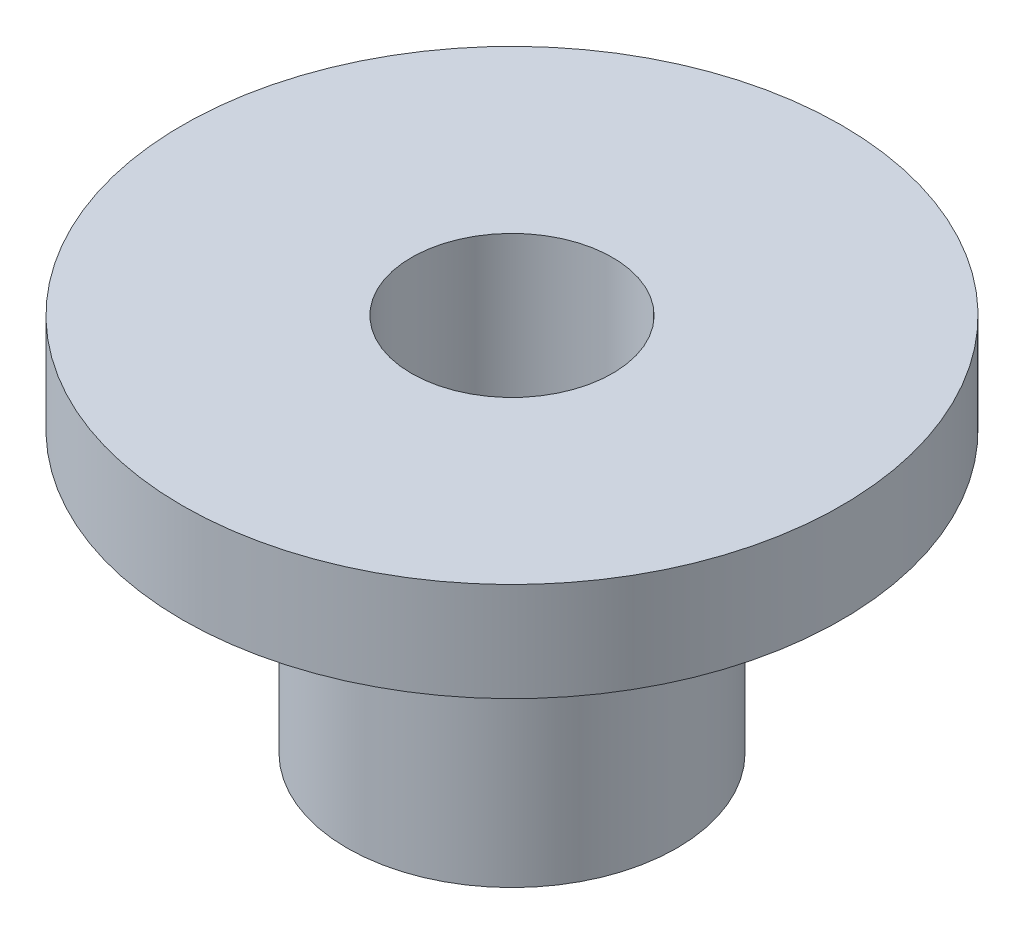
ISO-10303-21;
HEADER;
FILE_DESCRIPTION(('STEP AP214'),'2;1');
FILE_NAME('part.step','',(''),(''),'','','');
FILE_SCHEMA(('AUTOMOTIVE_DESIGN { 1 0 10303 214 1 1 1 1 }'));
ENDSEC;
DATA;
#1=APPLICATION_CONTEXT('core data for automotive mechanical design processes');
#2=APPLICATION_PROTOCOL_DEFINITION('international standard','automotive_design',2000,#1);
#3=PRODUCT_CONTEXT('',#1,'mechanical');
#4=PRODUCT('Part','Part','',(#3));
#5=PRODUCT_RELATED_PRODUCT_CATEGORY('part','',(#4));
#6=PRODUCT_DEFINITION_FORMATION('','',#4);
#7=PRODUCT_DEFINITION_CONTEXT('part definition',#1,'design');
#8=PRODUCT_DEFINITION('design','',#6,#7);
#9=PRODUCT_DEFINITION_SHAPE('','',#8);
#10=(LENGTH_UNIT() NAMED_UNIT(*) SI_UNIT(.MILLI.,.METRE.));
#11=(NAMED_UNIT(*) PLANE_ANGLE_UNIT() SI_UNIT($,.RADIAN.));
#12=(NAMED_UNIT(*) SI_UNIT($,.STERADIAN.) SOLID_ANGLE_UNIT());
#13=UNCERTAINTY_MEASURE_WITH_UNIT(LENGTH_MEASURE(1.E-05),#10,'distance_accuracy_value','');
#14=(GEOMETRIC_REPRESENTATION_CONTEXT(3) GLOBAL_UNCERTAINTY_ASSIGNED_CONTEXT((#13)) GLOBAL_UNIT_ASSIGNED_CONTEXT((#10,
#11,#12)) REPRESENTATION_CONTEXT('',''));
#15=CARTESIAN_POINT('',(0.,0.,0.));
#16=DIRECTION('',(0.,0.,1.));
#17=DIRECTION('',(1.,0.,0.));
#18=AXIS2_PLACEMENT_3D('',#15,#16,#17);
#19=CARTESIAN_POINT('',(0.,0.,0.));
#20=DIRECTION('',(0.,1.,0.));
#21=DIRECTION('',(0.,0.,1.));
#22=AXIS2_PLACEMENT_3D('',#19,#20,#21);
#23=PLANE('',#22);
#24=CARTESIAN_POINT('',(0.,0.,0.));
#25=DIRECTION('',(0.,1.,0.));
#26=DIRECTION('',(0.,0.,1.));
#27=AXIS2_PLACEMENT_3D('',#24,#25,#26);
#28=CIRCLE('',#27,5.);
#29=CARTESIAN_POINT('',(0.,0.,5.));
#30=VERTEX_POINT('',#29);
#31=EDGE_CURVE('E41',#30,#30,#28,.T.);
#32=ORIENTED_EDGE('',*,*,#31,.F.);
#33=EDGE_LOOP('',(#32));
#34=FACE_BOUND('',#33,.T.);
#35=CARTESIAN_POINT('',(0.,0.,0.));
#36=DIRECTION('',(0.,1.,0.));
#37=DIRECTION('',(0.,0.,1.));
#38=AXIS2_PLACEMENT_3D('',#35,#36,#37);
#39=CIRCLE('',#38,3.05);
#40=CARTESIAN_POINT('',(0.,0.,3.05));
#41=VERTEX_POINT('',#40);
#42=EDGE_CURVE('E50',#41,#41,#39,.T.);
#43=ORIENTED_EDGE('',*,*,#42,.T.);
#44=EDGE_LOOP('',(#43));
#45=FACE_BOUND('',#44,.T.);
#46=ADVANCED_FACE('F37',(#34,#45),#23,.F.);
#47=CARTESIAN_POINT('',(0.,8.5,0.));
#48=DIRECTION('',(0.,-1.,0.));
#49=DIRECTION('',(0.,0.,-1.));
#50=AXIS2_PLACEMENT_3D('',#47,#48,#49);
#51=CYLINDRICAL_SURFACE('',#50,5.);
#52=CARTESIAN_POINT('',(0.,8.5,0.));
#53=DIRECTION('',(0.,1.,0.));
#54=DIRECTION('',(0.,0.,1.));
#55=AXIS2_PLACEMENT_3D('',#52,#53,#54);
#56=CIRCLE('',#55,5.);
#57=CARTESIAN_POINT('',(0.,8.5,5.));
#58=VERTEX_POINT('',#57);
#59=EDGE_CURVE('E10',#58,#58,#56,.T.);
#60=ORIENTED_EDGE('',*,*,#59,.F.);
#61=EDGE_LOOP('',(#60));
#62=FACE_BOUND('',#61,.T.);
#63=ORIENTED_EDGE('',*,*,#31,.T.);
#64=EDGE_LOOP('',(#63));
#65=FACE_BOUND('',#64,.T.);
#66=ADVANCED_FACE('F39',(#62,#65),#51,.T.);
#67=CARTESIAN_POINT('',(0.,8.5,0.));
#68=DIRECTION('',(0.,-1.,0.));
#69=DIRECTION('',(0.,0.,-1.));
#70=AXIS2_PLACEMENT_3D('',#67,#68,#69);
#71=CYLINDRICAL_SURFACE('',#70,3.05);
#72=ORIENTED_EDGE('',*,*,#42,.F.);
#73=EDGE_LOOP('',(#72));
#74=FACE_BOUND('',#73,.T.);
#75=CARTESIAN_POINT('',(0.,11.5,0.));
#76=DIRECTION('',(0.,1.,0.));
#77=DIRECTION('',(0.,0.,1.));
#78=AXIS2_PLACEMENT_3D('',#75,#76,#77);
#79=CIRCLE('',#78,3.05);
#80=CARTESIAN_POINT('',(0.,11.5,3.05));
#81=VERTEX_POINT('',#80);
#82=EDGE_CURVE('E60',#81,#81,#79,.T.);
#83=ORIENTED_EDGE('',*,*,#82,.T.);
#84=EDGE_LOOP('',(#83));
#85=FACE_BOUND('',#84,.T.);
#86=ADVANCED_FACE('F68',(#74,#85),#71,.F.);
#87=CARTESIAN_POINT('',(0.,11.5,0.));
#88=DIRECTION('',(0.,1.,0.));
#89=DIRECTION('',(0.,0.,1.));
#90=AXIS2_PLACEMENT_3D('',#87,#88,#89);
#91=PLANE('',#90);
#92=CARTESIAN_POINT('',(0.,11.5,0.));
#93=DIRECTION('',(0.,1.,0.));
#94=DIRECTION('',(0.,0.,1.));
#95=AXIS2_PLACEMENT_3D('',#92,#93,#94);
#96=CIRCLE('',#95,10.);
#97=CARTESIAN_POINT('',(0.,11.5,10.));
#98=VERTEX_POINT('',#97);
#99=EDGE_CURVE('E55',#98,#98,#96,.T.);
#100=ORIENTED_EDGE('',*,*,#99,.T.);
#101=EDGE_LOOP('',(#100));
#102=FACE_BOUND('',#101,.T.);
#103=ORIENTED_EDGE('',*,*,#82,.F.);
#104=EDGE_LOOP('',(#103));
#105=FACE_BOUND('',#104,.T.);
#106=ADVANCED_FACE('F70',(#102,#105),#91,.T.);
#107=CARTESIAN_POINT('',(0.,8.5,0.));
#108=DIRECTION('',(0.,1.,0.));
#109=DIRECTION('',(0.,0.,1.));
#110=AXIS2_PLACEMENT_3D('',#107,#108,#109);
#111=PLANE('',#110);
#112=ORIENTED_EDGE('',*,*,#59,.T.);
#113=EDGE_LOOP('',(#112));
#114=FACE_BOUND('',#113,.T.);
#115=CARTESIAN_POINT('',(0.,8.5,0.));
#116=DIRECTION('',(0.,1.,0.));
#117=DIRECTION('',(0.,0.,1.));
#118=AXIS2_PLACEMENT_3D('',#115,#116,#117);
#119=CIRCLE('',#118,10.);
#120=CARTESIAN_POINT('',(0.,8.5,10.));
#121=VERTEX_POINT('',#120);
#122=EDGE_CURVE('E56',#121,#121,#119,.T.);
#123=ORIENTED_EDGE('',*,*,#122,.F.);
#124=EDGE_LOOP('',(#123));
#125=FACE_BOUND('',#124,.T.);
#126=ADVANCED_FACE('F72',(#114,#125),#111,.F.);
#127=CARTESIAN_POINT('',(0.,11.5,0.));
#128=DIRECTION('',(0.,-1.,0.));
#129=DIRECTION('',(0.,0.,-1.));
#130=AXIS2_PLACEMENT_3D('',#127,#128,#129);
#131=CYLINDRICAL_SURFACE('',#130,10.);
#132=ORIENTED_EDGE('',*,*,#99,.F.);
#133=EDGE_LOOP('',(#132));
#134=FACE_BOUND('',#133,.T.);
#135=ORIENTED_EDGE('',*,*,#122,.T.);
#136=EDGE_LOOP('',(#135));
#137=FACE_BOUND('',#136,.T.);
#138=ADVANCED_FACE('F79',(#134,#137),#131,.T.);
#139=CLOSED_SHELL('',(#46,#66,#86,#106,#126,#138));
#140=MANIFOLD_SOLID_BREP('B2',#139);
#141=ADVANCED_BREP_SHAPE_REPRESENTATION('',(#18,#140),#14);
#142=SHAPE_DEFINITION_REPRESENTATION(#9,#141);
ENDSEC;
END-ISO-10303-21;
